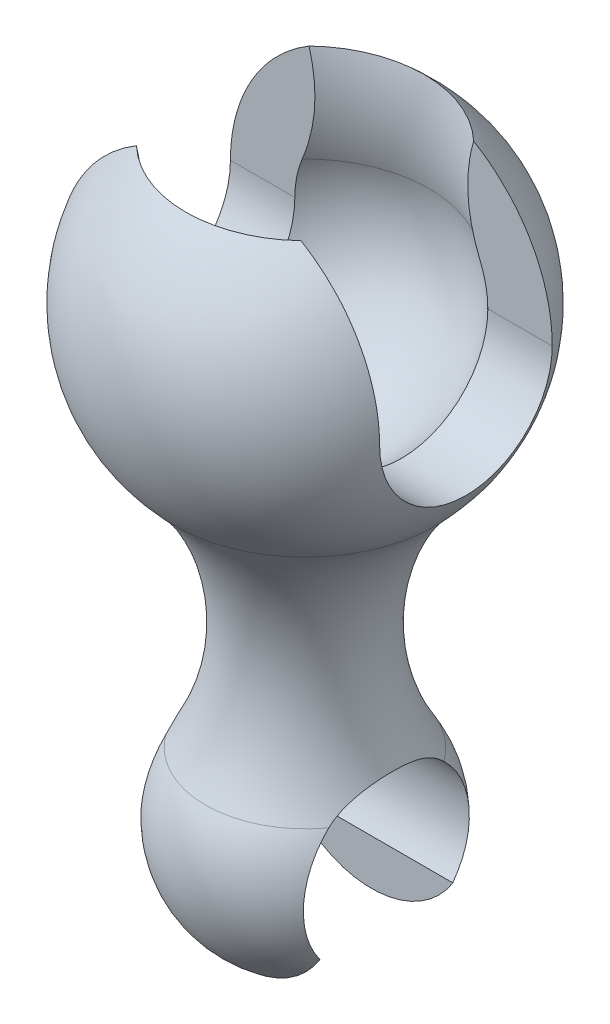
ISO-10303-21;
HEADER;
FILE_DESCRIPTION(('STEP AP214'),'2;1');
FILE_NAME('part.step','',(''),(''),'','','');
FILE_SCHEMA(('AUTOMOTIVE_DESIGN { 1 0 10303 214 1 1 1 1 }'));
ENDSEC;
DATA;
#1=APPLICATION_CONTEXT('core data for automotive mechanical design processes');
#2=APPLICATION_PROTOCOL_DEFINITION('international standard','automotive_design',2000,#1);
#3=PRODUCT_CONTEXT('',#1,'mechanical');
#4=PRODUCT('Part','Part','',(#3));
#5=PRODUCT_RELATED_PRODUCT_CATEGORY('part','',(#4));
#6=PRODUCT_DEFINITION_FORMATION('','',#4);
#7=PRODUCT_DEFINITION_CONTEXT('part definition',#1,'design');
#8=PRODUCT_DEFINITION('design','',#6,#7);
#9=PRODUCT_DEFINITION_SHAPE('','',#8);
#10=(LENGTH_UNIT() NAMED_UNIT(*) SI_UNIT(.MILLI.,.METRE.));
#11=(NAMED_UNIT(*) PLANE_ANGLE_UNIT() SI_UNIT($,.RADIAN.));
#12=(NAMED_UNIT(*) SI_UNIT($,.STERADIAN.) SOLID_ANGLE_UNIT());
#13=UNCERTAINTY_MEASURE_WITH_UNIT(LENGTH_MEASURE(1.E-05),#10,'distance_accuracy_value','');
#14=(GEOMETRIC_REPRESENTATION_CONTEXT(3) GLOBAL_UNCERTAINTY_ASSIGNED_CONTEXT((#13)) GLOBAL_UNIT_ASSIGNED_CONTEXT((#10,
#11,#12)) REPRESENTATION_CONTEXT('',''));
#15=CARTESIAN_POINT('',(0.,0.,0.));
#16=DIRECTION('',(0.,0.,1.));
#17=DIRECTION('',(1.,0.,0.));
#18=AXIS2_PLACEMENT_3D('',#15,#16,#17);
#19=CARTESIAN_POINT('',(0.,0.,0.));
#20=DIRECTION('',(1.,0.,0.));
#21=DIRECTION('',(0.,-1.,0.));
#22=AXIS2_PLACEMENT_3D('',#19,#20,#21);
#23=SPHERICAL_SURFACE('',#22,4.445);
#24=CARTESIAN_POINT('',(-3.11085197333464,0.,0.));
#25=DIRECTION('',(1.,0.,0.));
#26=DIRECTION('',(0.,1.,0.));
#27=AXIS2_PLACEMENT_3D('',#24,#25,#26);
#28=CIRCLE('',#27,3.175);
#29=CARTESIAN_POINT('',(-3.11085197333464,-1.905,-2.54));
#30=VERTEX_POINT('',#29);
#31=CARTESIAN_POINT('',(-3.11085197333464,2.2895251193108,-2.1997044637962));
#32=VERTEX_POINT('',#31);
#33=EDGE_CURVE('E511',#30,#32,#28,.T.);
#34=ORIENTED_EDGE('',*,*,#33,.T.);
#35=CARTESIAN_POINT('',(0.,2.2895251193108,0.));
#36=DIRECTION('',(0.,1.,0.));
#37=DIRECTION('',(1.,0.,0.));
#38=AXIS2_PLACEMENT_3D('',#35,#36,#37);
#39=CIRCLE('',#38,3.80999996431036);
#40=CARTESIAN_POINT('',(0.,2.2895251193108,-3.80999996431036));
#41=VERTEX_POINT('',#40);
#42=EDGE_CURVE('E11',#41,#32,#39,.T.);
#43=ORIENTED_EDGE('',*,*,#42,.F.);
#44=CARTESIAN_POINT('',(0.,2.2895251193108,0.));
#45=DIRECTION('',(0.,1.,0.));
#46=DIRECTION('',(1.,0.,0.));
#47=AXIS2_PLACEMENT_3D('',#44,#45,#46);
#48=CIRCLE('',#47,3.80999996431036);
#49=CARTESIAN_POINT('',(3.11085197333464,2.2895251193108,-2.1997044637962));
#50=VERTEX_POINT('',#49);
#51=EDGE_CURVE('E147',#50,#41,#48,.T.);
#52=ORIENTED_EDGE('',*,*,#51,.F.);
#53=CARTESIAN_POINT('',(3.11085197333464,0.,0.));
#54=DIRECTION('',(-1.,0.,0.));
#55=DIRECTION('',(0.,1.,0.));
#56=AXIS2_PLACEMENT_3D('',#53,#54,#55);
#57=CIRCLE('',#56,3.175);
#58=CARTESIAN_POINT('',(3.11085197333464,-1.905,-2.54));
#59=VERTEX_POINT('',#58);
#60=EDGE_CURVE('E61',#50,#59,#57,.T.);
#61=ORIENTED_EDGE('',*,*,#60,.T.);
#62=CARTESIAN_POINT('',(0.,0.,-2.54));
#63=DIRECTION('',(0.,0.,-1.));
#64=DIRECTION('',(0.,-1.,0.));
#65=AXIS2_PLACEMENT_3D('',#62,#63,#64);
#66=CIRCLE('',#65,3.64779728055165);
#67=EDGE_CURVE('E474',#59,#30,#66,.T.);
#68=ORIENTED_EDGE('',*,*,#67,.T.);
#69=EDGE_LOOP('',(#34,#43,#52,#61,#68));
#70=FACE_BOUND('',#69,.T.);
#71=ADVANCED_FACE('F16',(#70),#23,.T.);
#72=CARTESIAN_POINT('',(0.,0.,0.));
#73=DIRECTION('',(1.,0.,0.));
#74=DIRECTION('',(0.,-1.,0.));
#75=AXIS2_PLACEMENT_3D('',#72,#73,#74);
#76=SPHERICAL_SURFACE('',#75,4.445);
#77=CARTESIAN_POINT('',(-3.11085197333464,0.,0.));
#78=DIRECTION('',(1.,0.,0.));
#79=DIRECTION('',(0.,1.,0.));
#80=AXIS2_PLACEMENT_3D('',#77,#78,#79);
#81=CIRCLE('',#80,3.175);
#82=CARTESIAN_POINT('',(-3.11085197333464,2.2895251193108,2.1997044637962));
#83=VERTEX_POINT('',#82);
#84=CARTESIAN_POINT('',(-3.11085197333464,-1.90499989191691,2.54000008106232));
#85=VERTEX_POINT('',#84);
#86=EDGE_CURVE('E521',#83,#85,#81,.T.);
#87=ORIENTED_EDGE('',*,*,#86,.T.);
#88=CARTESIAN_POINT('',(0.,0.,2.54));
#89=DIRECTION('',(0.,0.,1.));
#90=DIRECTION('',(0.,1.,0.));
#91=AXIS2_PLACEMENT_3D('',#88,#89,#90);
#92=CIRCLE('',#91,3.64779728055165);
#93=CARTESIAN_POINT('',(3.11085197333464,-1.90499989191691,2.54000008106232));
#94=VERTEX_POINT('',#93);
#95=EDGE_CURVE('E172',#85,#94,#92,.T.);
#96=ORIENTED_EDGE('',*,*,#95,.T.);
#97=CARTESIAN_POINT('',(3.11085197333464,0.,0.));
#98=DIRECTION('',(-1.,0.,0.));
#99=DIRECTION('',(0.,1.,0.));
#100=AXIS2_PLACEMENT_3D('',#97,#98,#99);
#101=CIRCLE('',#100,3.175);
#102=CARTESIAN_POINT('',(3.11085197333464,2.2895251193108,2.1997044637962));
#103=VERTEX_POINT('',#102);
#104=EDGE_CURVE('E143',#94,#103,#101,.T.);
#105=ORIENTED_EDGE('',*,*,#104,.T.);
#106=CARTESIAN_POINT('',(0.,2.2895251193108,0.));
#107=DIRECTION('',(0.,1.,0.));
#108=DIRECTION('',(1.,0.,0.));
#109=AXIS2_PLACEMENT_3D('',#106,#107,#108);
#110=CIRCLE('',#109,3.80999996431036);
#111=EDGE_CURVE('E150',#83,#103,#110,.T.);
#112=ORIENTED_EDGE('',*,*,#111,.F.);
#113=EDGE_LOOP('',(#87,#96,#105,#112));
#114=FACE_BOUND('',#113,.T.);
#115=ADVANCED_FACE('F550',(#114),#76,.T.);
#116=CARTESIAN_POINT('',(0.,6.45034066886365,0.));
#117=DIRECTION('',(0.,1.,0.));
#118=DIRECTION('',(0.,0.,1.));
#119=AXIS2_PLACEMENT_3D('',#116,#117,#118);
#120=TOROIDAL_SURFACE('',#119,10.7340147674171,8.07801751861449);
#121=CARTESIAN_POINT('',(-3.11085197333465,2.2895251193108,-2.19970446379619));
#122=CARTESIAN_POINT('',(-3.11085159660627,2.30718980562536,-2.18131914571495));
#123=CARTESIAN_POINT('',(-3.11116420646459,2.32463519255812,-2.16272489226598));
#124=CARTESIAN_POINT('',(-3.11236655906103,2.35916174261197,-2.12503188202684));
#125=CARTESIAN_POINT('',(-3.11325944692021,2.37624039380972,-2.1059309232422));
#126=CARTESIAN_POINT('',(-3.11558011788451,2.41002677424511,-2.06721028893636));
#127=CARTESIAN_POINT('',(-3.11701143437225,2.42673126349027,-2.04758800065492));
#128=CARTESIAN_POINT('',(-3.12036545759822,2.4597633863373,-2.00781015716832));
#129=CARTESIAN_POINT('',(-3.12229192246671,2.47608704734374,-1.98765163032492));
#130=CARTESIAN_POINT('',(-3.12877244150496,2.52471641172048,-1.92605801627892));
#131=CARTESIAN_POINT('',(-3.13399234505691,2.55620825632446,-1.88404558981092));
#132=CARTESIAN_POINT('',(-3.14584441411478,2.61763531602778,-1.79769924797374));
#133=CARTESIAN_POINT('',(-3.15250486857746,2.64752167405017,-1.75333469743616));
#134=CARTESIAN_POINT('',(-3.16661757210742,2.70483185636383,-1.66356010660327));
#135=CARTESIAN_POINT('',(-3.17406465734575,2.73226979636139,-1.61815825129909));
#136=CARTESIAN_POINT('',(-3.18950568465921,2.78501585193632,-1.52572698171677));
#137=CARTESIAN_POINT('',(-3.19750355897386,2.81030496823566,-1.47868738124277));
#138=CARTESIAN_POINT('',(-3.21375489488693,2.85871764489817,-1.38283359880655));
#139=CARTESIAN_POINT('',(-3.22201026148733,2.88181201843224,-1.33400499972118));
#140=CARTESIAN_POINT('',(-3.23846703782302,2.92581178907907,-1.23443827649343));
#141=CARTESIAN_POINT('',(-3.24666564008938,2.94667782322147,-1.18368230147886));
#142=CARTESIAN_POINT('',(-3.26242188912435,2.98554386283423,-1.08185798744085));
#143=CARTESIAN_POINT('',(-3.26998718297799,3.00358147125913,-1.03080519303005));
#144=CARTESIAN_POINT('',(-3.28440381100371,3.03702966876446,-0.927767519626803));
#145=CARTESIAN_POINT('',(-3.29125542773776,3.05244129908136,-0.875783019147431));
#146=CARTESIAN_POINT('',(-3.30407178177235,3.08062262432645,-0.770787162704522));
#147=CARTESIAN_POINT('',(-3.31003318511543,3.09338245450285,-0.717772747437441));
#148=CARTESIAN_POINT('',(-3.3208897467432,3.11625386850335,-0.610634313650155));
#149=CARTESIAN_POINT('',(-3.32577630349309,3.1263442109646,-0.55650488484883));
#150=CARTESIAN_POINT('',(-3.33423485288278,3.14372438053338,-0.447944411947747));
#151=CARTESIAN_POINT('',(-3.3378126085862,3.15102649148772,-0.393515788112608));
#152=CARTESIAN_POINT('',(-3.3436022431843,3.16276720368402,-0.28450182445654));
#153=CARTESIAN_POINT('',(-3.34581962959923,3.1672173545342,-0.229918027516111));
#154=CARTESIAN_POINT('',(-3.34885633150502,3.17326174256575,-0.120538686706299));
#155=CARTESIAN_POINT('',(-3.34967527121339,3.17485521212199,-0.0657430898865653));
#156=CARTESIAN_POINT('',(-3.34988411646943,3.17519342508448,0.0441136441921867));
#157=CARTESIAN_POINT('',(-3.34926736667236,3.17392490215254,0.0991748326473101));
#158=CARTESIAN_POINT('',(-3.34661492217524,3.16865893182207,0.207636343115781));
#159=CARTESIAN_POINT('',(-3.34461808679348,3.16473627928844,0.261041279925697));
#160=CARTESIAN_POINT('',(-3.3393386281224,3.15423726523326,0.36720288785929));
#161=CARTESIAN_POINT('',(-3.33606376170255,3.14767690584708,0.419961525803612));
#162=CARTESIAN_POINT('',(-3.32833620959504,3.13192012887417,0.524888156556193));
#163=CARTESIAN_POINT('',(-3.32388587270053,3.12272896505834,0.577057113247571));
#164=CARTESIAN_POINT('',(-3.31390926028806,3.10173644865155,0.680872545293197));
#165=CARTESIAN_POINT('',(-3.30838082978967,3.0899298616066,0.732517752542665));
#166=CARTESIAN_POINT('',(-3.29684326525194,3.06481023380375,0.831124903579913));
#167=CARTESIAN_POINT('',(-3.29090350202924,3.05168213923695,0.878142284935583));
#168=CARTESIAN_POINT('',(-3.27843349525444,3.02338841379711,0.971097149666341));
#169=CARTESIAN_POINT('',(-3.27190790890318,3.00823845581775,1.01704002816551));
#170=CARTESIAN_POINT('',(-3.25842881482186,2.97592651492567,1.1079230376338));
#171=CARTESIAN_POINT('',(-3.25147724940529,2.95877338235772,1.15286660774858));
#172=CARTESIAN_POINT('',(-3.23729912985342,2.92248697416882,1.24183918872656));
#173=CARTESIAN_POINT('',(-3.23007290681425,2.90335603770944,1.28586920766545));
#174=CARTESIAN_POINT('',(-3.21584082944123,2.86406725283442,1.37107564125562));
#175=CARTESIAN_POINT('',(-3.20883956216176,2.84399352558763,1.41229163889735));
#176=CARTESIAN_POINT('',(-3.19508089035816,2.80237261857827,1.49322506349966));
#177=CARTESIAN_POINT('',(-3.18832140819967,2.78085175837268,1.53295565678027));
#178=CARTESIAN_POINT('',(-3.17524819928131,2.73636730248309,1.61100831704605));
#179=CARTESIAN_POINT('',(-3.16892997015743,2.71342500782333,1.64934176251609));
#180=CARTESIAN_POINT('',(-3.15693297673254,2.66612814994457,1.72469279433923));
#181=CARTESIAN_POINT('',(-3.15124850349799,2.64178980762033,1.76171964790922));
#182=CARTESIAN_POINT('',(-3.14070673429778,2.59172396612277,1.83455599604627));
#183=CARTESIAN_POINT('',(-3.13584389614147,2.56600745423834,1.87037222626418));
#184=CARTESIAN_POINT('',(-3.12725969338601,2.5134939807284,1.94037011289917));
#185=CARTESIAN_POINT('',(-3.12351998088988,2.48672352066656,1.97456935056003));
#186=CARTESIAN_POINT('',(-3.11739260381207,2.43213319851007,2.04141282419611));
#187=CARTESIAN_POINT('',(-3.11498592499936,2.40433446950798,2.07407250518197));
#188=CARTESIAN_POINT('',(-3.11172349954783,2.34772842999191,2.13790826908108));
#189=CARTESIAN_POINT('',(-3.1108500823721,2.31893656356487,2.16909716877664));
#190=CARTESIAN_POINT('',(-3.11085197333464,2.2895251193108,2.1997044637962));
#191=B_SPLINE_CURVE_WITH_KNOTS('',3,(#121,#122,#123,#124,#125,#126,#127,#128,#129,#130,#131,
#132,#133,#134,#135,#136,#137,#138,#139,#140,#141,#142,#143,#144,#145,#146,#147,#148,#149,#150,
#151,#152,#153,#154,#155,#156,#157,#158,#159,#160,#161,#162,#163,#164,#165,#166,#167,#168,#169,
#170,#171,#172,#173,#174,#175,#176,#177,#178,#179,#180,#181,#182,#183,#184,#185,#186,#187,#188,
#189,#190),.UNSPECIFIED.,.F.,.F.,(4,2,2,2,2,2,2,2,2,2,2,2,2,2,2,2,2,2,2,2,2,2,2,2,2,2,2,2,2,2,2,
2,2,2,4),(0.,0.0764832748905095,0.15338458771295,0.230799619708462,0.308820530293099,
0.467015034353222,0.628655822296701,0.789294682386328,0.951231440314627,1.11508561597098,
1.28147306589341,1.44541600337715,1.60929378318572,1.77377069057755,1.93951946581713,
2.10452935243459,2.26886670240357,2.43324820520883,2.59839323853864,2.75906818984098,
2.91878274044478,3.07818053688235,3.23790027823117,3.3853721953139,3.53176100114635,
3.67752590466355,3.82312034165246,3.96220708648079,4.09922758147286,4.23454195106014,
4.36851737091114,4.50154949724503,4.63227253769982,4.76107950127757,4.88839199682242),.UNSPECIFIED.);
#192=EDGE_CURVE('E516',#32,#83,#191,.T.);
#193=ORIENTED_EDGE('',*,*,#192,.T.);
#194=ORIENTED_EDGE('',*,*,#111,.T.);
#195=CARTESIAN_POINT('',(3.11085197333464,2.2895251193108,2.19970446379619));
#196=CARTESIAN_POINT('',(3.11085159660627,2.30718980562457,2.18131914571577));
#197=CARTESIAN_POINT('',(3.1111642064646,2.32463519255653,2.16272489226762));
#198=CARTESIAN_POINT('',(3.11236655906108,2.35916174260901,2.12503188202986));
#199=CARTESIAN_POINT('',(3.11325944692028,2.37624039380619,2.10593092324578));
#200=CARTESIAN_POINT('',(3.11558011788464,2.41002677424065,2.06721028894082));
#201=CARTESIAN_POINT('',(3.11701143437241,2.42673126348547,2.04758800065969));
#202=CARTESIAN_POINT('',(3.12036545759844,2.45976338633205,2.00781015717349));
#203=CARTESIAN_POINT('',(3.12229192246697,2.47608704733838,1.98765163033016));
#204=CARTESIAN_POINT('',(3.12877244150535,2.52471641171541,1.92605801628366));
#205=CARTESIAN_POINT('',(3.13399234505741,2.55620825631978,1.88404558981508));
#206=CARTESIAN_POINT('',(3.14584441411512,2.61763531602516,1.79769924797602));
#207=CARTESIAN_POINT('',(3.15250486857756,2.64752167404915,1.75333469743712));
#208=CARTESIAN_POINT('',(3.16661757210623,2.70483185636033,1.66356010660935));
#209=CARTESIAN_POINT('',(3.17406465734336,2.73226979635421,1.61815825131185));
#210=CARTESIAN_POINT('',(3.18950568465565,2.78501585192425,1.52572698173839));
#211=CARTESIAN_POINT('',(3.1975035589704,2.81030496822215,1.47868738126645));
#212=CARTESIAN_POINT('',(3.21375489488423,2.85871764488452,1.38283359883004));
#213=CARTESIAN_POINT('',(3.22201026148532,2.88181201841965,1.3340049997423));
#214=CARTESIAN_POINT('',(3.23846703782227,2.92581178907169,1.23443827650566));
#215=CARTESIAN_POINT('',(3.24666564008919,2.94667782321803,1.18368230148446));
#216=CARTESIAN_POINT('',(3.26242188912387,2.985543862836,1.08185798743961));
#217=CARTESIAN_POINT('',(3.26998718297674,3.0035814712625,1.03080519302875));
#218=CARTESIAN_POINT('',(3.28440381100153,3.03702966876978,0.92776751962536));
#219=CARTESIAN_POINT('',(3.29125542773544,3.05244129908704,0.875783019145919));
#220=CARTESIAN_POINT('',(3.30407178177005,3.08062262433212,0.770787162702935));
#221=CARTESIAN_POINT('',(3.3100331851133,3.09338245450816,0.717772747435851));
#222=CARTESIAN_POINT('',(3.32088974674197,3.11625386850669,0.610634313648484));
#223=CARTESIAN_POINT('',(3.3257763034926,3.12634421096632,0.556504884847081));
#224=CARTESIAN_POINT('',(3.33423485288401,3.14372438053324,0.447944411939768));
#225=CARTESIAN_POINT('',(3.33781260858828,3.15102649148704,0.393515788098416));
#226=CARTESIAN_POINT('',(3.34360224318689,3.1627672036826,0.284501824434021));
#227=CARTESIAN_POINT('',(3.34581962960158,3.1672173545328,0.229918027491507));
#228=CARTESIAN_POINT('',(3.34885633150649,3.17326174256436,0.120538686681629));
#229=CARTESIAN_POINT('',(3.34967527121432,3.17485521212082,0.0657430898639297));
#230=CARTESIAN_POINT('',(3.34988411646955,3.17519342508356,-0.0441136442065932));
#231=CARTESIAN_POINT('',(3.34926736667231,3.17392490215186,-0.0991748326555217));
#232=CARTESIAN_POINT('',(3.3466149221749,3.16865893182192,-0.207636343123843));
#233=CARTESIAN_POINT('',(3.3446180867927,3.16473627928794,-0.261041279939766));
#234=CARTESIAN_POINT('',(3.33933862812047,3.15423726523225,-0.367202887881299));
#235=CARTESIAN_POINT('',(3.33606376170002,3.14767690584608,-0.419961525827578));
#236=CARTESIAN_POINT('',(3.32833620959168,3.13192012887323,-0.52488815658002));
#237=CARTESIAN_POINT('',(3.32388587269704,3.12272896505764,-0.57705711326934));
#238=CARTESIAN_POINT('',(3.31390926028548,3.10173644865092,-0.680872545306734));
#239=CARTESIAN_POINT('',(3.30838082978822,3.08992986160598,-0.732517752550077));
#240=CARTESIAN_POINT('',(3.29684326525176,3.06481023380107,-0.831124903585925));
#241=CARTESIAN_POINT('',(3.29090350202901,3.05168213923167,-0.878142284946173));
#242=CARTESIAN_POINT('',(3.27843349525373,3.02338841378848,-0.971097149683026));
#243=CARTESIAN_POINT('',(3.27190790890209,3.00823845580849,-1.01704002818376));
#244=CARTESIAN_POINT('',(3.25842881482027,2.97592651491652,-1.10792303765198));
#245=CARTESIAN_POINT('',(3.2514772494036,2.95877338234944,-1.15286660776518));
#246=CARTESIAN_POINT('',(3.23729912985214,2.92248697416365,-1.24183918873676));
#247=CARTESIAN_POINT('',(3.23007290681351,2.90335603770666,-1.28586920767087));
#248=CARTESIAN_POINT('',(3.21584082944078,2.86406725283388,-1.3710756412574));
#249=CARTESIAN_POINT('',(3.20883956216105,2.84399352558671,-1.41229163890014));
#250=CARTESIAN_POINT('',(3.19508089035703,2.80237261857687,-1.49322506350377));
#251=CARTESIAN_POINT('',(3.18832140819838,2.78085175837121,-1.5329556567847));
#252=CARTESIAN_POINT('',(3.17524819927992,2.73636730248167,-1.61100831705043));
#253=CARTESIAN_POINT('',(3.16892997015608,2.71342500782206,-1.64934176252009));
#254=CARTESIAN_POINT('',(3.15693297673167,2.66612814994374,-1.72469279434173));
#255=CARTESIAN_POINT('',(3.15124850349753,2.64178980761979,-1.7617196479106));
#256=CARTESIAN_POINT('',(3.14070673429781,2.59172396612145,-1.83455599604764));
#257=CARTESIAN_POINT('',(3.13584389614163,2.56600745423583,-1.8703722262666));
#258=CARTESIAN_POINT('',(3.12725969338627,2.51349398072437,-1.94037011290302));
#259=CARTESIAN_POINT('',(3.1235199808901,2.48672352066221,-1.97456935056427));
#260=CARTESIAN_POINT('',(3.11739260381222,2.43213319850579,-2.04141282420035));
#261=CARTESIAN_POINT('',(3.11498592499947,2.40433446950412,-2.07407250518585));
#262=CARTESIAN_POINT('',(3.11172349954788,2.3477284299896,-2.1379082690834));
#263=CARTESIAN_POINT('',(3.11085008237211,2.31893656356373,-2.16909716877781));
#264=CARTESIAN_POINT('',(3.11085197333464,2.2895251193108,-2.1997044637962));
#265=B_SPLINE_CURVE_WITH_KNOTS('',3,(#195,#196,#197,#198,#199,#200,#201,#202,#203,#204,#205,
#206,#207,#208,#209,#210,#211,#212,#213,#214,#215,#216,#217,#218,#219,#220,#221,#222,#223,#224,
#225,#226,#227,#228,#229,#230,#231,#232,#233,#234,#235,#236,#237,#238,#239,#240,#241,#242,#243,
#244,#245,#246,#247,#248,#249,#250,#251,#252,#253,#254,#255,#256,#257,#258,#259,#260,#261,#262,
#263,#264),.UNSPECIFIED.,.F.,.F.,(4,2,2,2,2,2,2,2,2,2,2,2,2,2,2,2,2,2,2,2,2,2,2,2,2,2,2,2,2,2,2,
2,2,2,4),(0.,0.0764832748870876,0.153384587707128,0.230799619701258,0.308820530285514,
0.467015034347793,0.628655822297138,0.789294682363594,0.95123144028452,1.11508561594892,
1.28147306589426,1.44541600337942,1.6092937831884,1.77377069058,1.93951946581909,
2.10452935245495,2.26886670243017,2.43324820522933,2.59839323854057,2.75906818986098,
2.9187827404707,3.07818053690208,3.23790027823271,3.38537219533068,3.53176100116831,
3.67752590468025,3.82312034165315,3.96220708648477,4.09922758147787,4.23454195106392,
4.36851737091148,4.50154949724995,4.63227253770626,4.76107950128238,4.88839199682231),.UNSPECIFIED.);
#266=EDGE_CURVE('E152',#103,#50,#265,.T.);
#267=ORIENTED_EDGE('',*,*,#266,.T.);
#268=ORIENTED_EDGE('',*,*,#51,.T.);
#269=CARTESIAN_POINT('',(0.,6.45034066886365,-10.7340147674171));
#270=DIRECTION('',(-1.,0.,0.));
#271=DIRECTION('',(0.,0.,-1.));
#272=AXIS2_PLACEMENT_3D('',#269,#270,#271);
#273=CIRCLE('',#272,8.07801751861449);
#274=CARTESIAN_POINT('',(0.,12.1175808157846,-4.97756133251724));
#275=VERTEX_POINT('',#274);
#276=EDGE_CURVE('E28',#41,#275,#273,.T.);
#277=ORIENTED_EDGE('',*,*,#276,.T.);
#278=CARTESIAN_POINT('',(0.,12.1175808157846,0.));
#279=DIRECTION('',(0.,1.,0.));
#280=DIRECTION('',(1.,0.,0.));
#281=AXIS2_PLACEMENT_3D('',#278,#279,#280);
#282=CIRCLE('',#281,4.97756133251724);
#283=EDGE_CURVE('E457',#275,#275,#282,.T.);
#284=ORIENTED_EDGE('',*,*,#283,.F.);
#285=ORIENTED_EDGE('',*,*,#276,.F.);
#286=ORIENTED_EDGE('',*,*,#42,.T.);
#287=EDGE_LOOP('',(#193,#194,#267,#268,#277,#284,#285,#286));
#288=FACE_BOUND('',#287,.T.);
#289=ADVANCED_FACE('F155',(#288),#120,.F.);
#290=CARTESIAN_POINT('',(0.,0.,0.));
#291=DIRECTION('',(1.,0.,0.));
#292=DIRECTION('',(0.,1.,0.));
#293=AXIS2_PLACEMENT_3D('',#290,#291,#292);
#294=CYLINDRICAL_SURFACE('',#293,3.175);
#295=ORIENTED_EDGE('',*,*,#60,.F.);
#296=ORIENTED_EDGE('',*,*,#266,.F.);
#297=ORIENTED_EDGE('',*,*,#104,.F.);
#298=DIRECTION('',(1.,0.,0.));
#299=VECTOR('',#298,1.);
#300=CARTESIAN_POINT('',(0.,-1.90499989191691,2.54000008106232));
#301=LINE('',#300,#299);
#302=EDGE_CURVE('E166',#85,#94,#301,.T.);
#303=ORIENTED_EDGE('',*,*,#302,.F.);
#304=ORIENTED_EDGE('',*,*,#86,.F.);
#305=ORIENTED_EDGE('',*,*,#192,.F.);
#306=ORIENTED_EDGE('',*,*,#33,.F.);
#307=DIRECTION('',(-1.,0.,0.));
#308=VECTOR('',#307,1.);
#309=CARTESIAN_POINT('',(0.,-1.905,-2.54));
#310=LINE('',#309,#308);
#311=EDGE_CURVE('E163',#59,#30,#310,.T.);
#312=ORIENTED_EDGE('',*,*,#311,.F.);
#313=EDGE_LOOP('',(#295,#296,#297,#303,#304,#305,#306,#312));
#314=FACE_BOUND('',#313,.T.);
#315=ADVANCED_FACE('F161',(#314),#294,.F.);
#316=CARTESIAN_POINT('',(0.,-1.90499989191691,2.54));
#317=DIRECTION('',(0.,0.,1.));
#318=DIRECTION('',(1.,0.,0.));
#319=AXIS2_PLACEMENT_3D('',#316,#317,#318);
#320=PLANE('',#319);
#321=ORIENTED_EDGE('',*,*,#95,.F.);
#322=ORIENTED_EDGE('',*,*,#302,.T.);
#323=EDGE_LOOP('',(#321,#322));
#324=FACE_BOUND('',#323,.T.);
#325=ADVANCED_FACE('F554',(#324),#320,.F.);
#326=CARTESIAN_POINT('',(0.,-3.64779728055165,-2.54));
#327=DIRECTION('',(0.,0.,-1.));
#328=DIRECTION('',(0.,-1.,0.));
#329=AXIS2_PLACEMENT_3D('',#326,#327,#328);
#330=PLANE('',#329);
#331=ORIENTED_EDGE('',*,*,#67,.F.);
#332=ORIENTED_EDGE('',*,*,#311,.T.);
#333=EDGE_LOOP('',(#331,#332));
#334=FACE_BOUND('',#333,.T.);
#335=ADVANCED_FACE('F267',(#334),#330,.F.);
#336=CARTESIAN_POINT('',(0.,17.0180000000002,0.));
#337=DIRECTION('',(1.,0.,0.));
#338=DIRECTION('',(0.,-1.,0.));
#339=AXIS2_PLACEMENT_3D('',#336,#337,#338);
#340=SPHERICAL_SURFACE('',#339,4.953);
#341=CARTESIAN_POINT('',(0.,17.0180000000002,3.302));
#342=DIRECTION('',(0.,0.,-1.));
#343=DIRECTION('',(0.,1.,0.));
#344=AXIS2_PLACEMENT_3D('',#341,#342,#343);
#345=CIRCLE('',#344,3.69174823085214);
#346=CARTESIAN_POINT('',(3.40940688004103,18.4339624734892,3.302));
#347=VERTEX_POINT('',#346);
#348=CARTESIAN_POINT('',(3.69174823085214,17.0180000000002,3.302));
#349=VERTEX_POINT('',#348);
#350=EDGE_CURVE('E369',#347,#349,#345,.T.);
#351=ORIENTED_EDGE('',*,*,#350,.T.);
#352=CARTESIAN_POINT('',(3.69174823085214,17.0180000000002,0.));
#353=DIRECTION('',(-1.,0.,0.));
#354=DIRECTION('',(0.,1.,0.));
#355=AXIS2_PLACEMENT_3D('',#352,#353,#354);
#356=CIRCLE('',#355,3.302);
#357=CARTESIAN_POINT('',(3.69174823085214,17.0180000000002,-3.302));
#358=VERTEX_POINT('',#357);
#359=EDGE_CURVE('E442',#358,#349,#356,.T.);
#360=ORIENTED_EDGE('',*,*,#359,.F.);
#361=CARTESIAN_POINT('',(0.,17.0180000000002,-3.302));
#362=DIRECTION('',(0.,0.,1.));
#363=DIRECTION('',(0.,-1.,0.));
#364=AXIS2_PLACEMENT_3D('',#361,#362,#363);
#365=CIRCLE('',#364,3.69174823085214);
#366=CARTESIAN_POINT('',(3.40940688004103,18.4339624734892,-3.302));
#367=VERTEX_POINT('',#366);
#368=EDGE_CURVE('E228',#358,#367,#365,.T.);
#369=ORIENTED_EDGE('',*,*,#368,.T.);
#370=CARTESIAN_POINT('',(0.,18.4339624734892,0.));
#371=DIRECTION('',(0.,1.,0.));
#372=DIRECTION('',(1.,0.,0.));
#373=AXIS2_PLACEMENT_3D('',#370,#371,#372);
#374=CIRCLE('',#373,4.74628900022651);
#375=CARTESIAN_POINT('',(-3.40940688004103,18.4339624734892,-3.302));
#376=VERTEX_POINT('',#375);
#377=EDGE_CURVE('E462',#367,#376,#374,.T.);
#378=ORIENTED_EDGE('',*,*,#377,.T.);
#379=CARTESIAN_POINT('',(0.,17.0180000000002,-3.302));
#380=DIRECTION('',(0.,0.,1.));
#381=DIRECTION('',(0.,-1.,0.));
#382=AXIS2_PLACEMENT_3D('',#379,#380,#381);
#383=CIRCLE('',#382,3.69174823085214);
#384=CARTESIAN_POINT('',(-3.69174823085214,17.0180000000002,-3.302));
#385=VERTEX_POINT('',#384);
#386=EDGE_CURVE('E395',#376,#385,#383,.T.);
#387=ORIENTED_EDGE('',*,*,#386,.T.);
#388=CARTESIAN_POINT('',(-3.69174823085214,17.0180000000002,0.));
#389=DIRECTION('',(1.,0.,0.));
#390=DIRECTION('',(0.,1.,0.));
#391=AXIS2_PLACEMENT_3D('',#388,#389,#390);
#392=CIRCLE('',#391,3.302);
#393=CARTESIAN_POINT('',(-3.69174823085214,17.0180000000002,3.302));
#394=VERTEX_POINT('',#393);
#395=EDGE_CURVE('E424',#394,#385,#392,.T.);
#396=ORIENTED_EDGE('',*,*,#395,.F.);
#397=CARTESIAN_POINT('',(0.,17.0180000000002,3.302));
#398=DIRECTION('',(0.,0.,-1.));
#399=DIRECTION('',(0.,1.,0.));
#400=AXIS2_PLACEMENT_3D('',#397,#398,#399);
#401=CIRCLE('',#400,3.69174823085214);
#402=CARTESIAN_POINT('',(-3.40940688004103,18.4339624734892,3.302));
#403=VERTEX_POINT('',#402);
#404=EDGE_CURVE('E314',#394,#403,#401,.T.);
#405=ORIENTED_EDGE('',*,*,#404,.T.);
#406=CARTESIAN_POINT('',(0.,18.4339624734892,0.));
#407=DIRECTION('',(0.,1.,0.));
#408=DIRECTION('',(1.,0.,0.));
#409=AXIS2_PLACEMENT_3D('',#406,#407,#408);
#410=CIRCLE('',#409,4.74628900022651);
#411=EDGE_CURVE('E468',#403,#347,#410,.T.);
#412=ORIENTED_EDGE('',*,*,#411,.T.);
#413=EDGE_LOOP('',(#351,#360,#369,#378,#387,#396,#405,#412));
#414=FACE_BOUND('',#413,.T.);
#415=ADVANCED_FACE('F204',(#414),#340,.F.);
#416=CARTESIAN_POINT('',(0.,20.7433043413197,0.));
#417=DIRECTION('',(0.,1.,0.));
#418=DIRECTION('',(0.,0.,1.));
#419=AXIS2_PLACEMENT_3D('',#416,#417,#418);
#420=TOROIDAL_SURFACE('',#419,12.487174425585,8.07801751861449);
#421=CARTESIAN_POINT('',(3.14784640607683,22.3074313497532,3.30200000000001));
#422=CARTESIAN_POINT('',(3.11599124053935,22.1960534296855,3.30198302120155));
#423=CARTESIAN_POINT('',(3.08726198557588,22.0837676638094,3.30189669236568));
#424=CARTESIAN_POINT('',(3.03711287103679,21.8610652861451,3.30171677895808));
#425=CARTESIAN_POINT('',(3.01550197742587,21.7506915977512,3.30162348445755));
#426=CARTESIAN_POINT('',(2.97926079061261,21.5320507639262,3.30154629924158));
#427=CARTESIAN_POINT('',(2.96444806767797,21.4238139913448,3.3015593475282));
#428=CARTESIAN_POINT('',(2.94151817649625,21.2096625954994,3.30167520383376));
#429=CARTESIAN_POINT('',(2.93322677835924,21.1037667782247,3.30177551351432));
#430=CARTESIAN_POINT('',(2.92398437319727,20.9129779667444,3.30193601555061));
#431=CARTESIAN_POINT('',(2.92189328358443,20.8281397912204,3.3020002188948));
#432=CARTESIAN_POINT('',(2.92189336349523,20.6817956341999,3.30199984101184));
#433=CARTESIAN_POINT('',(2.92299265784829,20.6202883598759,3.30196581685184));
#434=CARTESIAN_POINT('',(2.92736645107759,20.496341278461,3.30187386475361));
#435=CARTESIAN_POINT('',(2.93067631753309,20.4339027157039,3.30181555405224));
#436=CARTESIAN_POINT('',(2.93883102348979,20.3179181543946,3.30171598308359));
#437=CARTESIAN_POINT('',(2.94339573040434,20.2643522604014,3.3016734785399));
#438=CARTESIAN_POINT('',(2.95415358197183,20.1566020662726,3.30160823563959));
#439=CARTESIAN_POINT('',(2.96036937527894,20.1024200590005,3.30158579277363));
#440=CARTESIAN_POINT('',(2.98167430826457,19.9377576996305,3.30155658984485));
#441=CARTESIAN_POINT('',(2.9992503321961,19.8275854793494,3.30159069547184));
#442=CARTESIAN_POINT('',(3.02856676956932,19.6721910191872,3.30172210504938));
#443=CARTESIAN_POINT('',(3.03775420261616,19.6264680562296,3.30177110414749));
#444=CARTESIAN_POINT('',(3.05988046989892,19.5228423826116,3.30185545925289));
#445=CARTESIAN_POINT('',(3.07315974774429,19.4650117307425,3.30188347226426));
#446=CARTESIAN_POINT('',(3.11264349659809,19.3040647245423,3.30191359234477));
#447=CARTESIAN_POINT('',(3.14074574453422,19.2014106362298,3.30187752932389));
#448=CARTESIAN_POINT('',(3.20409594994334,18.9903369060852,3.30185868598297));
#449=CARTESIAN_POINT('',(3.2397105665648,18.8820281356655,3.30187988867038));
#450=CARTESIAN_POINT('',(3.31884368620549,18.6599878151715,3.30193979525695));
#451=CARTESIAN_POINT('',(3.36273513652215,18.5463888383056,3.30197959198588));
#452=CARTESIAN_POINT('',(3.40940688004104,18.4339624734892,3.30200000000001));
#453=B_SPLINE_CURVE_WITH_KNOTS('',3,(#421,#422,#423,#424,#425,#426,#427,#428,#429,#430,#431,
#432,#433,#434,#435,#436,#437,#438,#439,#440,#441,#442,#443,#444,#445,#446,#447,#448,#449,#450,
#451,#452),.UNSPECIFIED.,.F.,.F.,(4,2,2,2,2,2,2,2,2,2,2,2,2,2,2,4),(0.,0.34750484896555,
0.684733010766426,1.01228935205908,1.33076520779688,1.5852556447856,1.76977022886385,
1.95730998018459,2.11856651945974,2.28216085135236,2.61663019089023,2.75653253896636,
2.93451236506762,3.25365732748104,3.59556069972096,3.96073194810354),.UNSPECIFIED.);
#454=CARTESIAN_POINT('',(3.14784640607681,22.3074313497532,3.302));
#455=VERTEX_POINT('',#454);
#456=EDGE_CURVE('E289',#455,#347,#453,.T.);
#457=ORIENTED_EDGE('',*,*,#456,.T.);
#458=ORIENTED_EDGE('',*,*,#411,.F.);
#459=CARTESIAN_POINT('',(-3.40940688004104,18.4339624734892,3.30200000000002));
#460=CARTESIAN_POINT('',(-3.3746487733033,18.5176719701945,3.30199296912596));
#461=CARTESIAN_POINT('',(-3.34142984007358,18.6020269987069,3.30197866326559));
#462=CARTESIAN_POINT('',(-3.27987737947648,18.7676243874922,3.30195881043871));
#463=CARTESIAN_POINT('',(-3.25138117546926,18.8488063669109,3.30195285435134));
#464=CARTESIAN_POINT('',(-3.19893296840741,19.0078830198722,3.30196744867077));
#465=CARTESIAN_POINT('',(-3.17482038166186,19.0857246208124,3.30198661457416));
#466=CARTESIAN_POINT('',(-3.13084523167446,19.2379726388609,3.30200608105374));
#467=CARTESIAN_POINT('',(-3.11082186263166,19.3123325360155,3.3020073611945));
#468=CARTESIAN_POINT('',(-3.0716641879375,19.4698158552465,3.30193246162614));
#469=CARTESIAN_POINT('',(-3.05285749870727,19.5530211340655,3.30184793051038));
#470=CARTESIAN_POINT('',(-3.01918805964293,19.7186096323561,3.30169406193857));
#471=CARTESIAN_POINT('',(-3.00425827728563,19.8009792288821,3.30162447045038));
#472=CARTESIAN_POINT('',(-2.97823593748774,19.9648044520302,3.30154035325113));
#473=CARTESIAN_POINT('',(-2.96707916178638,20.0462498513975,3.3015248591353));
#474=CARTESIAN_POINT('',(-2.94849497022728,20.2081364286887,3.3015671311987));
#475=CARTESIAN_POINT('',(-2.94100632723252,20.2885705776159,3.30162363356089));
#476=CARTESIAN_POINT('',(-2.92965024585799,20.4487726552447,3.30178004554214));
#477=CARTESIAN_POINT('',(-2.92574231039089,20.5285376615696,3.30187945053222));
#478=CARTESIAN_POINT('',(-2.92248788033699,20.65332347564,3.30197583855476));
#479=CARTESIAN_POINT('',(-2.92189496597465,20.6983141834832,3.3019985880795));
#480=CARTESIAN_POINT('',(-2.92189213759945,20.7760916334069,3.30200102867721));
#481=CARTESIAN_POINT('',(-2.92220497302303,20.8088786333856,3.30199072503552));
#482=CARTESIAN_POINT('',(-2.92430670367432,20.9199300194702,3.30193655253906));
#483=CARTESIAN_POINT('',(-2.92754140591799,20.9981718521615,3.30186594781692));
#484=CARTESIAN_POINT('',(-2.93750484299821,21.1560537508291,3.30172878464172));
#485=CARTESIAN_POINT('',(-2.94430450648312,21.2356892408497,3.3016623401754));
#486=CARTESIAN_POINT('',(-2.9614981225405,21.3962891835921,3.30157586827475));
#487=CARTESIAN_POINT('',(-2.97196564307806,21.4772457542874,3.30155686107753));
#488=CARTESIAN_POINT('',(-2.9966081623899,21.6404052903226,3.30157606653202));
#489=CARTESIAN_POINT('',(-3.01085933667968,21.7225967226594,3.30161554145145));
#490=CARTESIAN_POINT('',(-3.0431933613412,21.8881362420239,3.30173219830703));
#491=CARTESIAN_POINT('',(-3.06135500747688,21.9714689051707,3.30181020638912));
#492=CARTESIAN_POINT('',(-3.10164752221214,22.1391950700873,3.30194180913133));
#493=CARTESIAN_POINT('',(-3.12385994590404,22.2235690025778,3.30199480217331));
#494=CARTESIAN_POINT('',(-3.14784640607683,22.3074313497532,3.30200000000001));
#495=B_SPLINE_CURVE_WITH_KNOTS('',3,(#459,#460,#461,#462,#463,#464,#465,#466,#467,#468,#469,
#470,#471,#472,#473,#474,#475,#476,#477,#478,#479,#480,#481,#482,#483,#484,#485,#486,#487,#488,
#489,#490,#491,#492,#493,#494),.UNSPECIFIED.,.F.,.F.,(4,2,2,2,2,2,2,2,2,2,2,2,2,2,2,2,2,4),(0.,
0.271909397828048,0.52996531574918,0.774380273082671,1.00535315993232,1.26118439151945,
1.51224283651006,1.75878333559751,2.00105512048909,2.24055176454134,2.37552091677959,
2.47388183014379,2.70872354410752,2.94842565762626,3.19324028455954,3.44341650777206,
3.6992058376578,3.96086775336656),.UNSPECIFIED.);
#496=CARTESIAN_POINT('',(-3.14784640607681,22.3074313497532,3.302));
#497=VERTEX_POINT('',#496);
#498=EDGE_CURVE('E251',#403,#497,#495,.T.);
#499=ORIENTED_EDGE('',*,*,#498,.T.);
#500=CARTESIAN_POINT('',(0.,22.3074313497532,0.));
#501=DIRECTION('',(0.,-1.,0.));
#502=DIRECTION('',(0.,0.,1.));
#503=AXIS2_PLACEMENT_3D('',#500,#501,#502);
#504=CIRCLE('',#503,4.56203255098543);
#505=EDGE_CURVE('E293',#455,#497,#504,.T.);
#506=ORIENTED_EDGE('',*,*,#505,.F.);
#507=EDGE_LOOP('',(#457,#458,#499,#506));
#508=FACE_BOUND('',#507,.T.);
#509=ADVANCED_FACE('F201',(#508),#420,.T.);
#510=CARTESIAN_POINT('',(0.,20.7433043413197,0.));
#511=DIRECTION('',(0.,1.,0.));
#512=DIRECTION('',(0.,0.,-1.));
#513=AXIS2_PLACEMENT_3D('',#510,#511,#512);
#514=TOROIDAL_SURFACE('',#513,12.487174425585,8.07801751861449);
#515=CARTESIAN_POINT('',(-3.14784640607683,22.3074313497532,-3.30200000000001));
#516=CARTESIAN_POINT('',(-3.11599124053935,22.1960534296855,-3.30198302120155));
#517=CARTESIAN_POINT('',(-3.08726198557588,22.0837676638094,-3.30189669236567));
#518=CARTESIAN_POINT('',(-3.03711287103679,21.861065286145,-3.30171677895807));
#519=CARTESIAN_POINT('',(-3.01550197742587,21.7506915977512,-3.30162348445755));
#520=CARTESIAN_POINT('',(-2.97926079061261,21.5320507639261,-3.30154629924158));
#521=CARTESIAN_POINT('',(-2.96444806767797,21.4238139913448,-3.3015593475282));
#522=CARTESIAN_POINT('',(-2.94151817649625,21.2096625954994,-3.30167520383376));
#523=CARTESIAN_POINT('',(-2.93322677835924,21.1037667782246,-3.30177551351432));
#524=CARTESIAN_POINT('',(-2.92398437319727,20.9129779667444,-3.30193601555062));
#525=CARTESIAN_POINT('',(-2.92189328358443,20.8281397912204,-3.3020002188948));
#526=CARTESIAN_POINT('',(-2.92189336349524,20.6817956341999,-3.30199984101184));
#527=CARTESIAN_POINT('',(-2.92299265784829,20.6202883598759,-3.30196581685184));
#528=CARTESIAN_POINT('',(-2.92736645107759,20.496341278461,-3.30187386475361));
#529=CARTESIAN_POINT('',(-2.93067631753309,20.4339027157039,-3.30181555405224));
#530=CARTESIAN_POINT('',(-2.93883102348979,20.3179181543946,-3.30171598308359));
#531=CARTESIAN_POINT('',(-2.94339573040434,20.2643522604014,-3.3016734785399));
#532=CARTESIAN_POINT('',(-2.95415358197183,20.1566020662726,-3.30160823563959));
#533=CARTESIAN_POINT('',(-2.96036937527894,20.1024200590005,-3.30158579277363));
#534=CARTESIAN_POINT('',(-2.98167430826457,19.9377576996305,-3.30155658984485));
#535=CARTESIAN_POINT('',(-2.9992503321961,19.8275854793494,-3.30159069547184));
#536=CARTESIAN_POINT('',(-3.02856676956932,19.6721910191872,-3.30172210504938));
#537=CARTESIAN_POINT('',(-3.03775420261616,19.6264680562296,-3.30177110414749));
#538=CARTESIAN_POINT('',(-3.05988046989892,19.5228423826116,-3.30185545925289));
#539=CARTESIAN_POINT('',(-3.07315974774429,19.4650117307425,-3.30188347226426));
#540=CARTESIAN_POINT('',(-3.11264349659809,19.3040647245423,-3.30191359234477));
#541=CARTESIAN_POINT('',(-3.14074574453423,19.2014106362298,-3.30187752932389));
#542=CARTESIAN_POINT('',(-3.20409594994334,18.9903369060852,-3.30185868598297));
#543=CARTESIAN_POINT('',(-3.23971056656481,18.8820281356655,-3.30187988867038));
#544=CARTESIAN_POINT('',(-3.31884368620549,18.6599878151715,-3.30193979525695));
#545=CARTESIAN_POINT('',(-3.36273513652216,18.5463888383056,-3.30197959198588));
#546=CARTESIAN_POINT('',(-3.40940688004104,18.4339624734892,-3.30200000000001));
#547=B_SPLINE_CURVE_WITH_KNOTS('',3,(#515,#516,#517,#518,#519,#520,#521,#522,#523,#524,#525,
#526,#527,#528,#529,#530,#531,#532,#533,#534,#535,#536,#537,#538,#539,#540,#541,#542,#543,#544,
#545,#546),.UNSPECIFIED.,.F.,.F.,(4,2,2,2,2,2,2,2,2,2,2,2,2,2,2,4),(0.,0.347504848965564,
0.68473301076645,1.01228935205911,1.33076520779689,1.5852556447856,1.76977022886385,
1.95730998018459,2.11856651945974,2.28216085135236,2.61663019089023,2.75653253896636,
2.93451236506762,3.25365732748104,3.59556069972096,3.96073194810354),.UNSPECIFIED.);
#548=CARTESIAN_POINT('',(-3.14784640607681,22.3074313497532,-3.302));
#549=VERTEX_POINT('',#548);
#550=EDGE_CURVE('E183',#549,#376,#547,.T.);
#551=ORIENTED_EDGE('',*,*,#550,.T.);
#552=ORIENTED_EDGE('',*,*,#377,.F.);
#553=CARTESIAN_POINT('',(3.40940688004104,18.4339624734892,-3.30200000000002));
#554=CARTESIAN_POINT('',(3.37464877329628,18.5176719702115,-3.30199296912596));
#555=CARTESIAN_POINT('',(3.34142984005989,18.602026998741,-3.30197866326589));
#556=CARTESIAN_POINT('',(3.27987737945487,18.7676243875494,-3.30195881043979));
#557=CARTESIAN_POINT('',(3.25138117544594,18.8488063669739,-3.30195285435289));
#558=CARTESIAN_POINT('',(3.19893296838509,19.0078830199355,-3.30196744867308));
#559=CARTESIAN_POINT('',(3.17482038164179,19.0857246208701,-3.30198661457677));
#560=CARTESIAN_POINT('',(3.1308452316631,19.2379726388957,-3.30200608105564));
#561=CARTESIAN_POINT('',(3.11082186262628,19.312332536033,-3.30200736119547));
#562=CARTESIAN_POINT('',(3.07166418793508,19.4698158552609,-3.30193246162505));
#563=CARTESIAN_POINT('',(3.05285749870313,19.5530211340944,-3.30184793050814));
#564=CARTESIAN_POINT('',(3.01918805963707,19.7186096324044,-3.30169406193548));
#565=CARTESIAN_POINT('',(3.00425827727936,19.8009792289353,-3.30162447044758));
#566=CARTESIAN_POINT('',(2.97823593748215,19.9648044520835,-3.3015403532493));
#567=CARTESIAN_POINT('',(2.96707916178148,20.046249851446,-3.30152485913412));
#568=CARTESIAN_POINT('',(2.94849497022505,20.2081364287178,-3.30156713119829));
#569=CARTESIAN_POINT('',(2.94100632723184,20.2885705776305,-3.30162363356059));
#570=CARTESIAN_POINT('',(2.92965024585679,20.4487726552566,-3.30178004554247));
#571=CARTESIAN_POINT('',(2.92574231038879,20.5285376615936,-3.30187945053307));
#572=CARTESIAN_POINT('',(2.92248788033587,20.653323475664,-3.30197583855548));
#573=CARTESIAN_POINT('',(2.92189496597411,20.6983141834953,-3.30199858807998));
#574=CARTESIAN_POINT('',(2.92189213759984,20.7760916334103,-3.30200102867686));
#575=CARTESIAN_POINT('',(2.92220497302403,20.8088786333924,-3.30199072503469));
#576=CARTESIAN_POINT('',(2.9243067036772,20.9199300194863,-3.30193655253691));
#577=CARTESIAN_POINT('',(2.92754140592186,20.9981718521836,-3.30186594781435));
#578=CARTESIAN_POINT('',(2.93750484300403,21.1560537508606,-3.30172878463866));
#579=CARTESIAN_POINT('',(2.94430450648977,21.2356892408845,-3.30166234017227));
#580=CARTESIAN_POINT('',(2.96149812254849,21.396289183631,-3.30157586827182));
#581=CARTESIAN_POINT('',(2.97196564308643,21.4772457543271,-3.30155686107485));
#582=CARTESIAN_POINT('',(2.99660816239859,21.640405290361,-3.30157606652997));
#583=CARTESIAN_POINT('',(3.01085933668818,21.722596722696,-3.30161554144976));
#584=CARTESIAN_POINT('',(3.0431933613487,21.888136242054,-3.30173219830604));
#585=CARTESIAN_POINT('',(3.06135500748345,21.9714689051963,-3.30181020638847));
#586=CARTESIAN_POINT('',(3.10164752221601,22.1391950701014,-3.30194180913118));
#587=CARTESIAN_POINT('',(3.12385994590603,22.2235690025848,-3.30199480217332));
#588=CARTESIAN_POINT('',(3.14784640607683,22.3074313497532,-3.30200000000001));
#589=B_SPLINE_CURVE_WITH_KNOTS('',3,(#553,#554,#555,#556,#557,#558,#559,#560,#561,#562,#563,
#564,#565,#566,#567,#568,#569,#570,#571,#572,#573,#574,#575,#576,#577,#578,#579,#580,#581,#582,
#583,#584,#585,#586,#587,#588),.UNSPECIFIED.,.F.,.F.,(4,2,2,2,2,2,2,2,2,2,2,2,2,2,2,2,2,4),(0.,
0.271909397883045,0.529965315822454,0.77438027313762,1.0053531599325,1.26118439156325,
1.51224283656844,1.75878333564128,2.001055120489,2.24055176457731,2.37552091677952,
2.47388183015381,2.70872354413572,2.94842565766474,3.19324028460033,3.44341650780713,
3.69920583767909,3.96086775336598),.UNSPECIFIED.);
#590=CARTESIAN_POINT('',(3.14784640607681,22.3074313497532,-3.302));
#591=VERTEX_POINT('',#590);
#592=EDGE_CURVE('E224',#367,#591,#589,.T.);
#593=ORIENTED_EDGE('',*,*,#592,.T.);
#594=CARTESIAN_POINT('',(0.,22.3074313497532,0.));
#595=DIRECTION('',(0.,-1.,0.));
#596=DIRECTION('',(0.,0.,1.));
#597=AXIS2_PLACEMENT_3D('',#594,#595,#596);
#598=CIRCLE('',#597,4.56203255098543);
#599=EDGE_CURVE('E452',#549,#591,#598,.T.);
#600=ORIENTED_EDGE('',*,*,#599,.F.);
#601=EDGE_LOOP('',(#551,#552,#593,#600));
#602=FACE_BOUND('',#601,.T.);
#603=ADVANCED_FACE('F190',(#602),#514,.T.);
#604=CARTESIAN_POINT('',(0.,17.0180000000002,0.));
#605=DIRECTION('',(1.,0.,0.));
#606=DIRECTION('',(0.,-1.,0.));
#607=AXIS2_PLACEMENT_3D('',#604,#605,#606);
#608=SPHERICAL_SURFACE('',#607,6.985);
#609=ORIENTED_EDGE('',*,*,#283,.T.);
#610=EDGE_LOOP('',(#609));
#611=FACE_BOUND('',#610,.T.);
#612=CARTESIAN_POINT('',(0.,17.0180000000002,3.302));
#613=DIRECTION('',(0.,0.,1.));
#614=DIRECTION('',(0.,1.,0.));
#615=AXIS2_PLACEMENT_3D('',#612,#613,#614);
#616=CIRCLE('',#615,6.15524337455475);
#617=CARTESIAN_POINT('',(6.15524337455475,17.0180000000002,3.302));
#618=VERTEX_POINT('',#617);
#619=EDGE_CURVE('E382',#618,#455,#616,.T.);
#620=ORIENTED_EDGE('',*,*,#619,.T.);
#621=ORIENTED_EDGE('',*,*,#505,.T.);
#622=CARTESIAN_POINT('',(0.,17.0180000000002,3.302));
#623=DIRECTION('',(0.,0.,1.));
#624=DIRECTION('',(0.,1.,0.));
#625=AXIS2_PLACEMENT_3D('',#622,#623,#624);
#626=CIRCLE('',#625,6.15524337455475);
#627=CARTESIAN_POINT('',(-6.15524337455475,17.0180000000002,3.302));
#628=VERTEX_POINT('',#627);
#629=EDGE_CURVE('E324',#497,#628,#626,.T.);
#630=ORIENTED_EDGE('',*,*,#629,.T.);
#631=CARTESIAN_POINT('',(-6.15524337455475,17.0180000000002,0.));
#632=DIRECTION('',(1.,0.,0.));
#633=DIRECTION('',(0.,1.,0.));
#634=AXIS2_PLACEMENT_3D('',#631,#632,#633);
#635=CIRCLE('',#634,3.302);
#636=CARTESIAN_POINT('',(-6.15524337455475,17.0180000000002,-3.302));
#637=VERTEX_POINT('',#636);
#638=EDGE_CURVE('E430',#628,#637,#635,.T.);
#639=ORIENTED_EDGE('',*,*,#638,.T.);
#640=CARTESIAN_POINT('',(0.,17.0180000000002,-3.302));
#641=DIRECTION('',(0.,0.,-1.));
#642=DIRECTION('',(0.,-1.,0.));
#643=AXIS2_PLACEMENT_3D('',#640,#641,#642);
#644=CIRCLE('',#643,6.15524337455475);
#645=EDGE_CURVE('E410',#637,#549,#644,.T.);
#646=ORIENTED_EDGE('',*,*,#645,.T.);
#647=ORIENTED_EDGE('',*,*,#599,.T.);
#648=CARTESIAN_POINT('',(0.,17.0180000000002,-3.302));
#649=DIRECTION('',(0.,0.,-1.));
#650=DIRECTION('',(0.,-1.,0.));
#651=AXIS2_PLACEMENT_3D('',#648,#649,#650);
#652=CIRCLE('',#651,6.15524337455475);
#653=CARTESIAN_POINT('',(6.15524337455475,17.0180000000002,-3.302));
#654=VERTEX_POINT('',#653);
#655=EDGE_CURVE('E240',#591,#654,#652,.T.);
#656=ORIENTED_EDGE('',*,*,#655,.T.);
#657=CARTESIAN_POINT('',(6.15524337455475,17.0180000000002,0.));
#658=DIRECTION('',(-1.,0.,0.));
#659=DIRECTION('',(0.,1.,0.));
#660=AXIS2_PLACEMENT_3D('',#657,#658,#659);
#661=CIRCLE('',#660,3.302);
#662=EDGE_CURVE('E436',#654,#618,#661,.T.);
#663=ORIENTED_EDGE('',*,*,#662,.T.);
#664=EDGE_LOOP('',(#620,#621,#630,#639,#646,#647,#656,#663));
#665=FACE_BOUND('',#664,.T.);
#666=ADVANCED_FACE('F200',(#611,#665),#608,.T.);
#667=CARTESIAN_POINT('',(0.,17.0180000000002,0.));
#668=DIRECTION('',(1.,0.,0.));
#669=DIRECTION('',(0.,-1.,0.));
#670=AXIS2_PLACEMENT_3D('',#667,#668,#669);
#671=CYLINDRICAL_SURFACE('',#670,3.302);
#672=DIRECTION('',(-1.,0.,0.));
#673=VECTOR('',#672,1.);
#674=CARTESIAN_POINT('',(0.,17.0180000000002,3.302));
#675=LINE('',#674,#673);
#676=EDGE_CURVE('E388',#618,#349,#675,.T.);
#677=ORIENTED_EDGE('',*,*,#676,.F.);
#678=ORIENTED_EDGE('',*,*,#662,.F.);
#679=DIRECTION('',(-1.,0.,0.));
#680=VECTOR('',#679,1.);
#681=CARTESIAN_POINT('',(0.,17.0180000000002,-3.302));
#682=LINE('',#681,#680);
#683=EDGE_CURVE('E237',#654,#358,#682,.T.);
#684=ORIENTED_EDGE('',*,*,#683,.T.);
#685=ORIENTED_EDGE('',*,*,#359,.T.);
#686=EDGE_LOOP('',(#677,#678,#684,#685));
#687=FACE_BOUND('',#686,.T.);
#688=ADVANCED_FACE('F567',(#687),#671,.F.);
#689=CARTESIAN_POINT('',(0.,17.0180000000002,0.));
#690=DIRECTION('',(1.,0.,0.));
#691=DIRECTION('',(0.,-1.,0.));
#692=AXIS2_PLACEMENT_3D('',#689,#690,#691);
#693=CYLINDRICAL_SURFACE('',#692,3.302);
#694=DIRECTION('',(-1.,0.,0.));
#695=VECTOR('',#694,1.);
#696=CARTESIAN_POINT('',(0.,17.0180000000002,3.302));
#697=LINE('',#696,#695);
#698=EDGE_CURVE('E244',#394,#628,#697,.T.);
#699=ORIENTED_EDGE('',*,*,#698,.F.);
#700=ORIENTED_EDGE('',*,*,#395,.T.);
#701=DIRECTION('',(-1.,0.,0.));
#702=VECTOR('',#701,1.);
#703=CARTESIAN_POINT('',(0.,17.0180000000002,-3.302));
#704=LINE('',#703,#702);
#705=EDGE_CURVE('E416',#385,#637,#704,.T.);
#706=ORIENTED_EDGE('',*,*,#705,.T.);
#707=ORIENTED_EDGE('',*,*,#638,.F.);
#708=EDGE_LOOP('',(#699,#700,#706,#707));
#709=FACE_BOUND('',#708,.T.);
#710=ADVANCED_FACE('F579',(#709),#693,.F.);
#711=CARTESIAN_POINT('',(12.7000004053116,17.0180000000002,-3.302));
#712=DIRECTION('',(0.,0.,-1.));
#713=DIRECTION('',(0.,-1.,0.));
#714=AXIS2_PLACEMENT_3D('',#711,#712,#713);
#715=PLANE('',#714);
#716=ORIENTED_EDGE('',*,*,#386,.F.);
#717=ORIENTED_EDGE('',*,*,#550,.F.);
#718=ORIENTED_EDGE('',*,*,#645,.F.);
#719=ORIENTED_EDGE('',*,*,#705,.F.);
#720=EDGE_LOOP('',(#716,#717,#718,#719));
#721=FACE_BOUND('',#720,.T.);
#722=ADVANCED_FACE('F304',(#721),#715,.F.);
#723=CARTESIAN_POINT('',(-17.4441802106227,17.0180000000002,3.302));
#724=DIRECTION('',(0.,0.,1.));
#725=DIRECTION('',(1.,0.,0.));
#726=AXIS2_PLACEMENT_3D('',#723,#724,#725);
#727=PLANE('',#726);
#728=ORIENTED_EDGE('',*,*,#350,.F.);
#729=ORIENTED_EDGE('',*,*,#456,.F.);
#730=ORIENTED_EDGE('',*,*,#619,.F.);
#731=ORIENTED_EDGE('',*,*,#676,.T.);
#732=EDGE_LOOP('',(#728,#729,#730,#731));
#733=FACE_BOUND('',#732,.T.);
#734=ADVANCED_FACE('F295',(#733),#727,.F.);
#735=CARTESIAN_POINT('',(12.7000004053116,17.0180000000002,-3.302));
#736=DIRECTION('',(0.,0.,-1.));
#737=DIRECTION('',(0.,-1.,0.));
#738=AXIS2_PLACEMENT_3D('',#735,#736,#737);
#739=PLANE('',#738);
#740=ORIENTED_EDGE('',*,*,#655,.F.);
#741=ORIENTED_EDGE('',*,*,#592,.F.);
#742=ORIENTED_EDGE('',*,*,#368,.F.);
#743=ORIENTED_EDGE('',*,*,#683,.F.);
#744=EDGE_LOOP('',(#740,#741,#742,#743));
#745=FACE_BOUND('',#744,.T.);
#746=ADVANCED_FACE('F18',(#745),#739,.F.);
#747=CARTESIAN_POINT('',(-17.4441802106227,17.0180000000002,3.302));
#748=DIRECTION('',(0.,0.,1.));
#749=DIRECTION('',(1.,0.,0.));
#750=AXIS2_PLACEMENT_3D('',#747,#748,#749);
#751=PLANE('',#750);
#752=ORIENTED_EDGE('',*,*,#629,.F.);
#753=ORIENTED_EDGE('',*,*,#498,.F.);
#754=ORIENTED_EDGE('',*,*,#404,.F.);
#755=ORIENTED_EDGE('',*,*,#698,.T.);
#756=EDGE_LOOP('',(#752,#753,#754,#755));
#757=FACE_BOUND('',#756,.T.);
#758=ADVANCED_FACE('F305',(#757),#751,.F.);
#759=CLOSED_SHELL('',(#71,#115,#289,#315,#325,#335,#415,#509,#603,#666,#688,#710,#722,#734,#746,#758));
#760=MANIFOLD_SOLID_BREP('B1',#759);
#761=ADVANCED_BREP_SHAPE_REPRESENTATION('',(#18,#760),#14);
#762=SHAPE_DEFINITION_REPRESENTATION(#9,#761);
ENDSEC;
END-ISO-10303-21;
